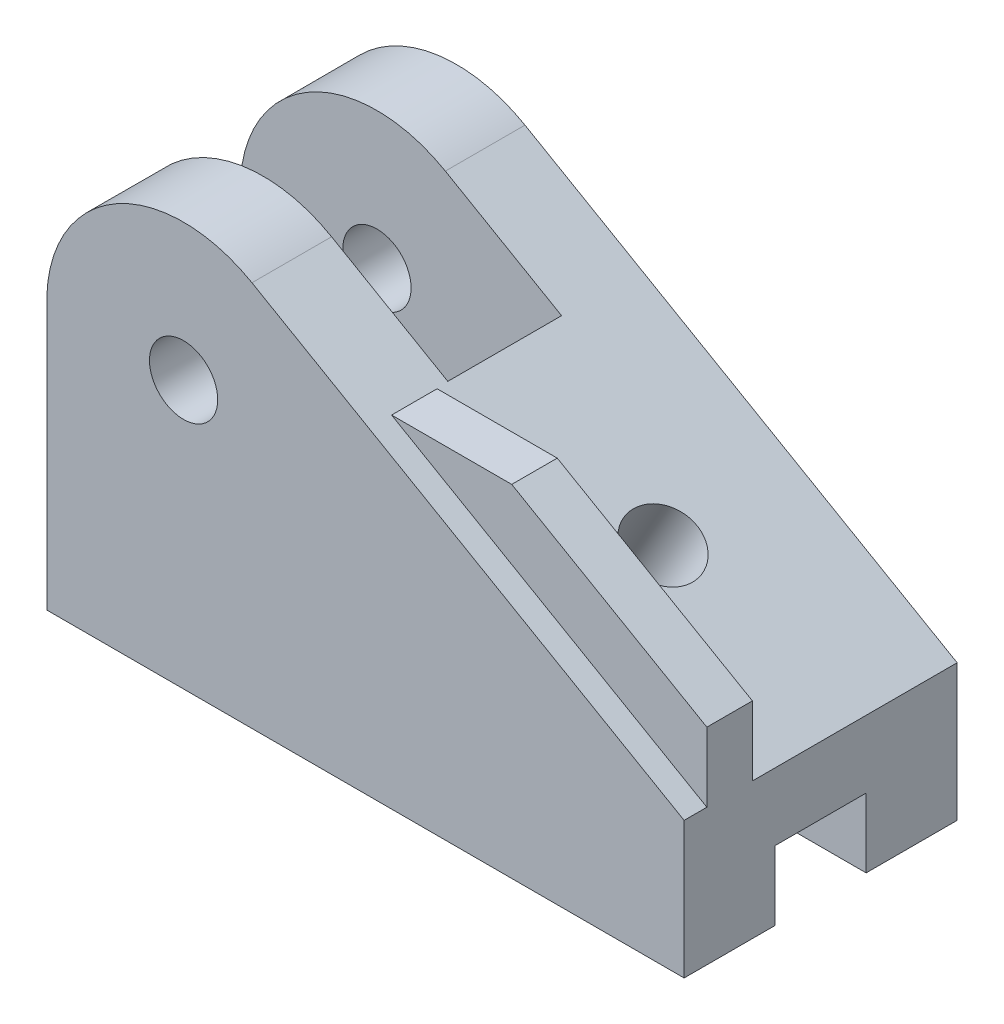
ISO-10303-21;
HEADER;
FILE_DESCRIPTION(('STEP AP214'),'2;1');
FILE_NAME('part.step','',(''),(''),'','','');
FILE_SCHEMA(('AUTOMOTIVE_DESIGN { 1 0 10303 214 1 1 1 1 }'));
ENDSEC;
DATA;
#1=APPLICATION_CONTEXT('core data for automotive mechanical design processes');
#2=APPLICATION_PROTOCOL_DEFINITION('international standard','automotive_design',2000,#1);
#3=PRODUCT_CONTEXT('',#1,'mechanical');
#4=PRODUCT('Part','Part','',(#3));
#5=PRODUCT_RELATED_PRODUCT_CATEGORY('part','',(#4));
#6=PRODUCT_DEFINITION_FORMATION('','',#4);
#7=PRODUCT_DEFINITION_CONTEXT('part definition',#1,'design');
#8=PRODUCT_DEFINITION('design','',#6,#7);
#9=PRODUCT_DEFINITION_SHAPE('','',#8);
#10=(LENGTH_UNIT() NAMED_UNIT(*) SI_UNIT(.MILLI.,.METRE.));
#11=(NAMED_UNIT(*) PLANE_ANGLE_UNIT() SI_UNIT($,.RADIAN.));
#12=(NAMED_UNIT(*) SI_UNIT($,.STERADIAN.) SOLID_ANGLE_UNIT());
#13=UNCERTAINTY_MEASURE_WITH_UNIT(LENGTH_MEASURE(1.E-05),#10,'distance_accuracy_value','');
#14=(GEOMETRIC_REPRESENTATION_CONTEXT(3) GLOBAL_UNCERTAINTY_ASSIGNED_CONTEXT((#13)) GLOBAL_UNIT_ASSIGNED_CONTEXT((#10,
#11,#12)) REPRESENTATION_CONTEXT('',''));
#15=CARTESIAN_POINT('',(0.,0.,0.));
#16=DIRECTION('',(0.,0.,1.));
#17=DIRECTION('',(1.,0.,0.));
#18=AXIS2_PLACEMENT_3D('',#15,#16,#17);
#19=CARTESIAN_POINT('',(30.4738919710462,52.7823291982181,19.05));
#20=DIRECTION('',(-0.499999999999994,-0.866025403784442,0.));
#21=DIRECTION('',(0.866025403784442,-0.499999999999994,0.));
#22=AXIS2_PLACEMENT_3D('',#19,#20,#21);
#23=PLANE('',#22);
#24=CARTESIAN_POINT('',(66.9029547438752,31.7499999999999,0.));
#25=DIRECTION('',(0.499999999999994,0.866025403784442,0.));
#26=DIRECTION('',(-0.866025403784442,0.499999999999995,0.));
#27=AXIS2_PLACEMENT_3D('',#24,#25,#26);
#28=CIRCLE('',#27,4.76249999999998);
#29=CARTESIAN_POINT('',(62.7785087583518,34.1312499999999,0.));
#30=VERTEX_POINT('',#29);
#31=EDGE_CURVE('E322',#30,#30,#28,.T.);
#32=ORIENTED_EDGE('',*,*,#31,.F.);
#33=EDGE_LOOP('',(#32));
#34=FACE_BOUND('',#33,.T.);
#35=DIRECTION('',(0.,0.,-1.));
#36=VECTOR('',#35,1.);
#37=CARTESIAN_POINT('',(28.5935637077948,53.8679372271712,19.05));
#38=LINE('',#37,#36);
#39=CARTESIAN_POINT('',(28.5935637077948,53.8679372271712,-7.9375));
#40=VERTEX_POINT('',#39);
#41=CARTESIAN_POINT('',(28.5935637077948,53.8679372271712,-19.05));
#42=VERTEX_POINT('',#41);
#43=EDGE_CURVE('E300',#40,#42,#38,.T.);
#44=ORIENTED_EDGE('',*,*,#43,.F.);
#45=DIRECTION('',(0.866025403784442,-0.499999999999994,0.));
#46=VECTOR('',#45,1.);
#47=CARTESIAN_POINT('',(30.4738919710462,52.7823291982181,-7.9375));
#48=LINE('',#47,#46);
#49=CARTESIAN_POINT('',(44.8118693429842,44.5042941028951,-7.9375));
#50=VERTEX_POINT('',#49);
#51=EDGE_CURVE('E205',#40,#50,#48,.T.);
#52=ORIENTED_EDGE('',*,*,#51,.T.);
#53=DIRECTION('',(0.,0.,1.));
#54=VECTOR('',#53,1.);
#55=CARTESIAN_POINT('',(44.8118693429842,44.5042941028951,19.05));
#56=LINE('',#55,#54);
#57=CARTESIAN_POINT('',(44.8118693429842,44.5042941028951,7.9375));
#58=VERTEX_POINT('',#57);
#59=EDGE_CURVE('E11',#50,#58,#56,.T.);
#60=ORIENTED_EDGE('',*,*,#59,.T.);
#61=DIRECTION('',(0.866025403784442,-0.499999999999994,0.));
#62=VECTOR('',#61,1.);
#63=CARTESIAN_POINT('',(30.4738919710462,52.7823291982181,7.9375));
#64=LINE('',#63,#62);
#65=CARTESIAN_POINT('',(28.5935637077948,53.8679372271712,7.9375));
#66=VERTEX_POINT('',#65);
#67=EDGE_CURVE('E200',#66,#58,#64,.T.);
#68=ORIENTED_EDGE('',*,*,#67,.F.);
#69=CARTESIAN_POINT('',(28.5935637077948,53.8679372271712,19.05));
#70=VERTEX_POINT('',#69);
#71=EDGE_CURVE('E302',#70,#66,#38,.T.);
#72=ORIENTED_EDGE('',*,*,#71,.F.);
#73=DIRECTION('',(-0.866025403784442,0.499999999999994,0.));
#74=VECTOR('',#73,1.);
#75=CARTESIAN_POINT('',(30.4738919710462,52.7823291982181,19.05));
#76=LINE('',#75,#74);
#77=CARTESIAN_POINT('',(88.9,19.05,19.05));
#78=VERTEX_POINT('',#77);
#79=EDGE_CURVE('E260',#78,#70,#76,.T.);
#80=ORIENTED_EDGE('',*,*,#79,.F.);
#81=DIRECTION('',(0.,0.,-1.));
#82=VECTOR('',#81,1.);
#83=CARTESIAN_POINT('',(88.9,19.05,19.05));
#84=LINE('',#83,#82);
#85=CARTESIAN_POINT('',(88.9,19.05,15.875));
#86=VERTEX_POINT('',#85);
#87=EDGE_CURVE('E287',#78,#86,#84,.T.);
#88=ORIENTED_EDGE('',*,*,#87,.T.);
#89=DIRECTION('',(0.866025403784442,-0.499999999999995,0.));
#90=VECTOR('',#89,1.);
#91=CARTESIAN_POINT('',(88.9,19.05,15.875));
#92=LINE('',#91,#90);
#93=CARTESIAN_POINT('',(44.9059094877499,44.45,15.875));
#94=VERTEX_POINT('',#93);
#95=EDGE_CURVE('E209',#94,#86,#92,.T.);
#96=ORIENTED_EDGE('',*,*,#95,.F.);
#97=DIRECTION('',(0.,0.,-1.));
#98=VECTOR('',#97,1.);
#99=CARTESIAN_POINT('',(44.9059094877499,44.45,15.875));
#100=LINE('',#99,#98);
#101=CARTESIAN_POINT('',(44.9059094877499,44.45,9.525));
#102=VERTEX_POINT('',#101);
#103=EDGE_CURVE('E220',#94,#102,#100,.T.);
#104=ORIENTED_EDGE('',*,*,#103,.T.);
#105=DIRECTION('',(0.866025403784442,-0.499999999999995,0.));
#106=VECTOR('',#105,1.);
#107=CARTESIAN_POINT('',(88.9,19.05,9.525));
#108=LINE('',#107,#106);
#109=CARTESIAN_POINT('',(88.9,19.05,9.525));
#110=VERTEX_POINT('',#109);
#111=EDGE_CURVE('E208',#102,#110,#108,.T.);
#112=ORIENTED_EDGE('',*,*,#111,.T.);
#113=CARTESIAN_POINT('',(88.9,19.05,-19.05));
#114=VERTEX_POINT('',#113);
#115=EDGE_CURVE('E273',#110,#114,#84,.T.);
#116=ORIENTED_EDGE('',*,*,#115,.T.);
#117=DIRECTION('',(-0.866025403784442,0.499999999999994,0.));
#118=VECTOR('',#117,1.);
#119=CARTESIAN_POINT('',(30.4738919710462,52.7823291982181,-19.05));
#120=LINE('',#119,#118);
#121=EDGE_CURVE('E259',#114,#42,#120,.T.);
#122=ORIENTED_EDGE('',*,*,#121,.T.);
#123=EDGE_LOOP('',(#44,#52,#60,#68,#72,#80,#88,#96,#104,#112,#116,#122));
#124=FACE_BOUND('',#123,.T.);
#125=ADVANCED_FACE('F40',(#34,#124),#23,.F.);
#126=CARTESIAN_POINT('',(0.,0.,19.05));
#127=DIRECTION('',(0.,1.,0.));
#128=DIRECTION('',(0.,0.,1.));
#129=AXIS2_PLACEMENT_3D('',#126,#127,#128);
#130=PLANE('',#129);
#131=DIRECTION('',(0.,0.,-1.));
#132=VECTOR('',#131,1.);
#133=CARTESIAN_POINT('',(0.,0.,19.05));
#134=LINE('',#133,#132);
#135=CARTESIAN_POINT('',(0.,0.,19.05));
#136=VERTEX_POINT('',#135);
#137=CARTESIAN_POINT('',(0.,0.,6.35));
#138=VERTEX_POINT('',#137);
#139=EDGE_CURVE('E294',#136,#138,#134,.T.);
#140=ORIENTED_EDGE('',*,*,#139,.T.);
#141=DIRECTION('',(1.,0.,0.));
#142=VECTOR('',#141,1.);
#143=CARTESIAN_POINT('',(-0.0371274155897411,0.,6.35));
#144=LINE('',#143,#142);
#145=CARTESIAN_POINT('',(88.9,0.,6.35));
#146=VERTEX_POINT('',#145);
#147=EDGE_CURVE('E245',#138,#146,#144,.T.);
#148=ORIENTED_EDGE('',*,*,#147,.T.);
#149=DIRECTION('',(0.,0.,-1.));
#150=VECTOR('',#149,1.);
#151=CARTESIAN_POINT('',(88.9,0.,19.05));
#152=LINE('',#151,#150);
#153=CARTESIAN_POINT('',(88.9,0.,19.05));
#154=VERTEX_POINT('',#153);
#155=EDGE_CURVE('E290',#154,#146,#152,.T.);
#156=ORIENTED_EDGE('',*,*,#155,.F.);
#157=DIRECTION('',(1.,0.,0.));
#158=VECTOR('',#157,1.);
#159=CARTESIAN_POINT('',(0.,0.,19.05));
#160=LINE('',#159,#158);
#161=EDGE_CURVE('E269',#136,#154,#160,.T.);
#162=ORIENTED_EDGE('',*,*,#161,.F.);
#163=EDGE_LOOP('',(#140,#148,#156,#162));
#164=FACE_BOUND('',#163,.T.);
#165=ADVANCED_FACE('F362',(#164),#130,.F.);
#166=CARTESIAN_POINT('',(19.05,37.338,19.05));
#167=DIRECTION('',(0.,0.,-1.));
#168=DIRECTION('',(-1.,0.,0.));
#169=AXIS2_PLACEMENT_3D('',#166,#167,#168);
#170=CYLINDRICAL_SURFACE('',#169,19.0871274155897);
#171=DIRECTION('',(0.,0.,-1.));
#172=VECTOR('',#171,1.);
#173=CARTESIAN_POINT('',(0.,38.527929821022,19.05));
#174=LINE('',#173,#172);
#175=CARTESIAN_POINT('',(0.,38.527929821022,7.9375));
#176=VERTEX_POINT('',#175);
#177=CARTESIAN_POINT('',(0.,38.527929821022,-7.9375));
#178=VERTEX_POINT('',#177);
#179=EDGE_CURVE('E47',#176,#178,#174,.T.);
#180=ORIENTED_EDGE('',*,*,#179,.T.);
#181=CARTESIAN_POINT('',(19.05,37.338,-7.9375));
#182=DIRECTION('',(0.,0.,-1.));
#183=DIRECTION('',(-1.,0.,0.));
#184=AXIS2_PLACEMENT_3D('',#181,#182,#183);
#185=CIRCLE('',#184,19.0871274155897);
#186=EDGE_CURVE('E202',#178,#40,#185,.T.);
#187=ORIENTED_EDGE('',*,*,#186,.T.);
#188=ORIENTED_EDGE('',*,*,#43,.T.);
#189=CARTESIAN_POINT('',(19.05,37.338,-19.05));
#190=DIRECTION('',(0.,0.,1.));
#191=DIRECTION('',(1.,0.,0.));
#192=AXIS2_PLACEMENT_3D('',#189,#190,#191);
#193=CIRCLE('',#192,19.0871274155897);
#194=CARTESIAN_POINT('',(0.,36.148070178978,-19.05));
#195=VERTEX_POINT('',#194);
#196=EDGE_CURVE('E276',#42,#195,#193,.T.);
#197=ORIENTED_EDGE('',*,*,#196,.T.);
#198=DIRECTION('',(0.,0.,-1.));
#199=VECTOR('',#198,1.);
#200=CARTESIAN_POINT('',(0.,36.148070178978,19.05));
#201=LINE('',#200,#199);
#202=CARTESIAN_POINT('',(0.,36.148070178978,-7.9375));
#203=VERTEX_POINT('',#202);
#204=EDGE_CURVE('E297',#203,#195,#201,.T.);
#205=ORIENTED_EDGE('',*,*,#204,.F.);
#206=CARTESIAN_POINT('',(0.,36.148070178978,7.9375));
#207=VERTEX_POINT('',#206);
#208=EDGE_CURVE('E301',#207,#203,#201,.T.);
#209=ORIENTED_EDGE('',*,*,#208,.F.);
#210=CARTESIAN_POINT('',(0.,36.148070178978,19.05));
#211=VERTEX_POINT('',#210);
#212=EDGE_CURVE('E298',#211,#207,#201,.T.);
#213=ORIENTED_EDGE('',*,*,#212,.F.);
#214=CARTESIAN_POINT('',(19.05,37.338,19.05));
#215=DIRECTION('',(0.,0.,1.));
#216=DIRECTION('',(1.,0.,0.));
#217=AXIS2_PLACEMENT_3D('',#214,#215,#216);
#218=CIRCLE('',#217,19.0871274155897);
#219=EDGE_CURVE('E263',#70,#211,#218,.T.);
#220=ORIENTED_EDGE('',*,*,#219,.F.);
#221=ORIENTED_EDGE('',*,*,#71,.T.);
#222=CARTESIAN_POINT('',(19.05,37.338,7.9375));
#223=DIRECTION('',(0.,0.,-1.));
#224=DIRECTION('',(-1.,0.,0.));
#225=AXIS2_PLACEMENT_3D('',#222,#223,#224);
#226=CIRCLE('',#225,19.0871274155897);
#227=EDGE_CURVE('E194',#176,#66,#226,.T.);
#228=ORIENTED_EDGE('',*,*,#227,.F.);
#229=EDGE_LOOP('',(#180,#187,#188,#197,#205,#209,#213,#220,#221,#228));
#230=FACE_BOUND('',#229,.T.);
#231=ADVANCED_FACE('F308',(#230),#170,.T.);
#232=CARTESIAN_POINT('',(0.,0.,19.05));
#233=DIRECTION('',(-1.,0.,0.));
#234=DIRECTION('',(0.,0.,1.));
#235=AXIS2_PLACEMENT_3D('',#232,#233,#234);
#236=PLANE('',#235);
#237=DIRECTION('',(0.,-1.,0.));
#238=VECTOR('',#237,1.);
#239=CARTESIAN_POINT('',(0.,0.,-7.9375));
#240=LINE('',#239,#238);
#241=CARTESIAN_POINT('',(0.,25.4,-7.9375));
#242=VERTEX_POINT('',#241);
#243=EDGE_CURVE('E171',#203,#242,#240,.T.);
#244=ORIENTED_EDGE('',*,*,#243,.F.);
#245=ORIENTED_EDGE('',*,*,#204,.T.);
#246=DIRECTION('',(0.,1.,0.));
#247=VECTOR('',#246,1.);
#248=CARTESIAN_POINT('',(0.,0.,-19.05));
#249=LINE('',#248,#247);
#250=CARTESIAN_POINT('',(0.,0.,-19.05));
#251=VERTEX_POINT('',#250);
#252=EDGE_CURVE('E279',#251,#195,#249,.T.);
#253=ORIENTED_EDGE('',*,*,#252,.F.);
#254=CARTESIAN_POINT('',(0.,0.,-6.35));
#255=VERTEX_POINT('',#254);
#256=EDGE_CURVE('E293',#255,#251,#134,.T.);
#257=ORIENTED_EDGE('',*,*,#256,.F.);
#258=DIRECTION('',(0.,-1.,0.));
#259=VECTOR('',#258,1.);
#260=CARTESIAN_POINT('',(0.,0.,-6.35));
#261=LINE('',#260,#259);
#262=CARTESIAN_POINT('',(0.,9.652,-6.35));
#263=VERTEX_POINT('',#262);
#264=EDGE_CURVE('E248',#263,#255,#261,.T.);
#265=ORIENTED_EDGE('',*,*,#264,.F.);
#266=DIRECTION('',(0.,0.,-1.));
#267=VECTOR('',#266,1.);
#268=CARTESIAN_POINT('',(0.,9.652,19.05));
#269=LINE('',#268,#267);
#270=CARTESIAN_POINT('',(0.,9.652,6.35));
#271=VERTEX_POINT('',#270);
#272=EDGE_CURVE('E255',#271,#263,#269,.T.);
#273=ORIENTED_EDGE('',*,*,#272,.F.);
#274=DIRECTION('',(0.,1.,0.));
#275=VECTOR('',#274,1.);
#276=CARTESIAN_POINT('',(0.,0.,6.35));
#277=LINE('',#276,#275);
#278=EDGE_CURVE('E257',#138,#271,#277,.T.);
#279=ORIENTED_EDGE('',*,*,#278,.F.);
#280=ORIENTED_EDGE('',*,*,#139,.F.);
#281=DIRECTION('',(0.,1.,0.));
#282=VECTOR('',#281,1.);
#283=CARTESIAN_POINT('',(0.,0.,19.05));
#284=LINE('',#283,#282);
#285=EDGE_CURVE('E266',#136,#211,#284,.T.);
#286=ORIENTED_EDGE('',*,*,#285,.T.);
#287=ORIENTED_EDGE('',*,*,#212,.T.);
#288=DIRECTION('',(0.,-1.,0.));
#289=VECTOR('',#288,1.);
#290=CARTESIAN_POINT('',(0.,0.,7.9375));
#291=LINE('',#290,#289);
#292=CARTESIAN_POINT('',(0.,25.4,7.9375));
#293=VERTEX_POINT('',#292);
#294=EDGE_CURVE('E181',#207,#293,#291,.T.);
#295=ORIENTED_EDGE('',*,*,#294,.T.);
#296=DIRECTION('',(0.,0.,1.));
#297=VECTOR('',#296,1.);
#298=CARTESIAN_POINT('',(0.,25.4,-7.9375));
#299=LINE('',#298,#297);
#300=EDGE_CURVE('E185',#242,#293,#299,.T.);
#301=ORIENTED_EDGE('',*,*,#300,.F.);
#302=EDGE_LOOP('',(#244,#245,#253,#257,#265,#273,#279,#280,#286,#287,#295,#301));
#303=FACE_BOUND('',#302,.T.);
#304=ADVANCED_FACE('F191',(#303),#236,.T.);
#305=CARTESIAN_POINT('',(88.9,0.,-6.34999999999999));
#306=VERTEX_POINT('',#305);
#307=CARTESIAN_POINT('',(88.9,0.,-19.05));
#308=VERTEX_POINT('',#307);
#309=EDGE_CURVE('E289',#306,#308,#152,.T.);
#310=ORIENTED_EDGE('',*,*,#309,.F.);
#311=DIRECTION('',(1.,0.,0.));
#312=VECTOR('',#311,1.);
#313=CARTESIAN_POINT('',(-0.0371274155897411,0.,-6.35));
#314=LINE('',#313,#312);
#315=EDGE_CURVE('E244',#255,#306,#314,.T.);
#316=ORIENTED_EDGE('',*,*,#315,.F.);
#317=ORIENTED_EDGE('',*,*,#256,.T.);
#318=DIRECTION('',(1.,0.,0.));
#319=VECTOR('',#318,1.);
#320=CARTESIAN_POINT('',(0.,0.,-19.05));
#321=LINE('',#320,#319);
#322=EDGE_CURVE('E282',#251,#308,#321,.T.);
#323=ORIENTED_EDGE('',*,*,#322,.T.);
#324=EDGE_LOOP('',(#310,#316,#317,#323));
#325=FACE_BOUND('',#324,.T.);
#326=ADVANCED_FACE('F411',(#325),#130,.F.);
#327=CARTESIAN_POINT('',(88.9,0.,19.05));
#328=DIRECTION('',(-1.,0.,0.));
#329=DIRECTION('',(0.,0.,1.));
#330=AXIS2_PLACEMENT_3D('',#327,#328,#329);
#331=PLANE('',#330);
#332=ORIENTED_EDGE('',*,*,#155,.T.);
#333=DIRECTION('',(0.,-1.,0.));
#334=VECTOR('',#333,1.);
#335=CARTESIAN_POINT('',(88.9,0.,6.35));
#336=LINE('',#335,#334);
#337=CARTESIAN_POINT('',(88.9,9.652,6.35));
#338=VERTEX_POINT('',#337);
#339=EDGE_CURVE('E242',#338,#146,#336,.T.);
#340=ORIENTED_EDGE('',*,*,#339,.F.);
#341=DIRECTION('',(0.,0.,1.));
#342=VECTOR('',#341,1.);
#343=CARTESIAN_POINT('',(88.9,9.652,-6.35));
#344=LINE('',#343,#342);
#345=CARTESIAN_POINT('',(88.9,9.652,-6.35));
#346=VERTEX_POINT('',#345);
#347=EDGE_CURVE('E239',#346,#338,#344,.T.);
#348=ORIENTED_EDGE('',*,*,#347,.F.);
#349=DIRECTION('',(0.,1.,0.));
#350=VECTOR('',#349,1.);
#351=CARTESIAN_POINT('',(88.9,0.,-6.35));
#352=LINE('',#351,#350);
#353=EDGE_CURVE('E236',#306,#346,#352,.T.);
#354=ORIENTED_EDGE('',*,*,#353,.F.);
#355=ORIENTED_EDGE('',*,*,#309,.T.);
#356=DIRECTION('',(0.,1.,0.));
#357=VECTOR('',#356,1.);
#358=CARTESIAN_POINT('',(88.9,0.,-19.05));
#359=LINE('',#358,#357);
#360=EDGE_CURVE('E264',#308,#114,#359,.T.);
#361=ORIENTED_EDGE('',*,*,#360,.T.);
#362=ORIENTED_EDGE('',*,*,#115,.F.);
#363=DIRECTION('',(0.,1.,0.));
#364=VECTOR('',#363,1.);
#365=CARTESIAN_POINT('',(88.9,19.05,9.525));
#366=LINE('',#365,#364);
#367=CARTESIAN_POINT('',(88.9,28.7286999126949,9.525));
#368=VERTEX_POINT('',#367);
#369=EDGE_CURVE('E223',#110,#368,#366,.T.);
#370=ORIENTED_EDGE('',*,*,#369,.T.);
#371=DIRECTION('',(0.,0.,-1.));
#372=VECTOR('',#371,1.);
#373=CARTESIAN_POINT('',(88.9,28.7286999126949,15.875));
#374=LINE('',#373,#372);
#375=CARTESIAN_POINT('',(88.9,28.7286999126949,15.875));
#376=VERTEX_POINT('',#375);
#377=EDGE_CURVE('E233',#376,#368,#374,.T.);
#378=ORIENTED_EDGE('',*,*,#377,.F.);
#379=DIRECTION('',(0.,1.,0.));
#380=VECTOR('',#379,1.);
#381=CARTESIAN_POINT('',(88.9,19.05,15.875));
#382=LINE('',#381,#380);
#383=EDGE_CURVE('E212',#86,#376,#382,.T.);
#384=ORIENTED_EDGE('',*,*,#383,.F.);
#385=ORIENTED_EDGE('',*,*,#87,.F.);
#386=DIRECTION('',(0.,1.,0.));
#387=VECTOR('',#386,1.);
#388=CARTESIAN_POINT('',(88.9,0.,19.05));
#389=LINE('',#388,#387);
#390=EDGE_CURVE('E271',#154,#78,#389,.T.);
#391=ORIENTED_EDGE('',*,*,#390,.F.);
#392=EDGE_LOOP('',(#332,#340,#348,#354,#355,#361,#362,#370,#378,#384,#385,#391));
#393=FACE_BOUND('',#392,.T.);
#394=ADVANCED_FACE('F348',(#393),#331,.F.);
#395=CARTESIAN_POINT('',(0.,0.,19.05));
#396=DIRECTION('',(0.,0.,1.));
#397=DIRECTION('',(1.,0.,0.));
#398=AXIS2_PLACEMENT_3D('',#395,#396,#397);
#399=PLANE('',#398);
#400=CARTESIAN_POINT('',(19.05,37.338,19.05));
#401=DIRECTION('',(0.,0.,1.));
#402=DIRECTION('',(1.,0.,0.));
#403=AXIS2_PLACEMENT_3D('',#400,#401,#402);
#404=CIRCLE('',#403,4.76249999999999);
#405=CARTESIAN_POINT('',(23.8125,37.338,19.05));
#406=VERTEX_POINT('',#405);
#407=EDGE_CURVE('E338',#406,#406,#404,.T.);
#408=ORIENTED_EDGE('',*,*,#407,.F.);
#409=EDGE_LOOP('',(#408));
#410=FACE_BOUND('',#409,.T.);
#411=ORIENTED_EDGE('',*,*,#79,.T.);
#412=ORIENTED_EDGE('',*,*,#219,.T.);
#413=ORIENTED_EDGE('',*,*,#285,.F.);
#414=ORIENTED_EDGE('',*,*,#161,.T.);
#415=ORIENTED_EDGE('',*,*,#390,.T.);
#416=EDGE_LOOP('',(#411,#412,#413,#414,#415));
#417=FACE_BOUND('',#416,.T.);
#418=ADVANCED_FACE('F344',(#410,#417),#399,.T.);
#419=CARTESIAN_POINT('',(0.,0.,-19.05));
#420=DIRECTION('',(0.,0.,1.));
#421=DIRECTION('',(1.,0.,0.));
#422=AXIS2_PLACEMENT_3D('',#419,#420,#421);
#423=PLANE('',#422);
#424=CARTESIAN_POINT('',(19.05,37.338,-19.05));
#425=DIRECTION('',(0.,0.,1.));
#426=DIRECTION('',(1.,0.,0.));
#427=AXIS2_PLACEMENT_3D('',#424,#425,#426);
#428=CIRCLE('',#427,4.76249999999998);
#429=CARTESIAN_POINT('',(23.8125,37.338,-19.05));
#430=VERTEX_POINT('',#429);
#431=EDGE_CURVE('E335',#430,#430,#428,.T.);
#432=ORIENTED_EDGE('',*,*,#431,.T.);
#433=EDGE_LOOP('',(#432));
#434=FACE_BOUND('',#433,.T.);
#435=ORIENTED_EDGE('',*,*,#121,.F.);
#436=ORIENTED_EDGE('',*,*,#360,.F.);
#437=ORIENTED_EDGE('',*,*,#322,.F.);
#438=ORIENTED_EDGE('',*,*,#252,.T.);
#439=ORIENTED_EDGE('',*,*,#196,.F.);
#440=EDGE_LOOP('',(#435,#436,#437,#438,#439));
#441=FACE_BOUND('',#440,.T.);
#442=ADVANCED_FACE('F347',(#434,#441),#423,.F.);
#443=CARTESIAN_POINT('',(-0.0371274155897411,0.,6.35));
#444=DIRECTION('',(0.,0.,1.));
#445=DIRECTION('',(1.,0.,0.));
#446=AXIS2_PLACEMENT_3D('',#443,#444,#445);
#447=PLANE('',#446);
#448=ORIENTED_EDGE('',*,*,#278,.T.);
#449=DIRECTION('',(1.,0.,0.));
#450=VECTOR('',#449,1.);
#451=CARTESIAN_POINT('',(-0.0371274155897411,9.652,6.35));
#452=LINE('',#451,#450);
#453=EDGE_CURVE('E249',#271,#338,#452,.T.);
#454=ORIENTED_EDGE('',*,*,#453,.T.);
#455=ORIENTED_EDGE('',*,*,#339,.T.);
#456=ORIENTED_EDGE('',*,*,#147,.F.);
#457=EDGE_LOOP('',(#448,#454,#455,#456));
#458=FACE_BOUND('',#457,.T.);
#459=ADVANCED_FACE('F435',(#458),#447,.F.);
#460=CARTESIAN_POINT('',(-0.0371274155897411,9.652,-6.35));
#461=DIRECTION('',(0.,1.,0.));
#462=DIRECTION('',(0.,0.,1.));
#463=AXIS2_PLACEMENT_3D('',#460,#461,#462);
#464=PLANE('',#463);
#465=CARTESIAN_POINT('',(54.1446684953231,9.652,0.));
#466=DIRECTION('',(0.,1.,0.));
#467=DIRECTION('',(1.,0.,0.));
#468=AXIS2_PLACEMENT_3D('',#465,#466,#467);
#469=ELLIPSE('',#468,5.49926131403114,4.76249999999998);
#470=CARTESIAN_POINT('',(59.6439298093542,9.652,0.));
#471=VERTEX_POINT('',#470);
#472=EDGE_CURVE('E317',#471,#471,#469,.T.);
#473=ORIENTED_EDGE('',*,*,#472,.T.);
#474=EDGE_LOOP('',(#473));
#475=FACE_BOUND('',#474,.T.);
#476=ORIENTED_EDGE('',*,*,#272,.T.);
#477=DIRECTION('',(1.,0.,0.));
#478=VECTOR('',#477,1.);
#479=CARTESIAN_POINT('',(-0.0371274155897411,9.652,-6.35));
#480=LINE('',#479,#478);
#481=EDGE_CURVE('E251',#263,#346,#480,.T.);
#482=ORIENTED_EDGE('',*,*,#481,.T.);
#483=ORIENTED_EDGE('',*,*,#347,.T.);
#484=ORIENTED_EDGE('',*,*,#453,.F.);
#485=EDGE_LOOP('',(#476,#482,#483,#484));
#486=FACE_BOUND('',#485,.T.);
#487=ADVANCED_FACE('F432',(#475,#486),#464,.F.);
#488=CARTESIAN_POINT('',(-0.0371274155897411,0.,-6.35));
#489=DIRECTION('',(0.,0.,-1.));
#490=DIRECTION('',(-1.,0.,0.));
#491=AXIS2_PLACEMENT_3D('',#488,#489,#490);
#492=PLANE('',#491);
#493=ORIENTED_EDGE('',*,*,#264,.T.);
#494=ORIENTED_EDGE('',*,*,#315,.T.);
#495=ORIENTED_EDGE('',*,*,#353,.T.);
#496=ORIENTED_EDGE('',*,*,#481,.F.);
#497=EDGE_LOOP('',(#493,#494,#495,#496));
#498=FACE_BOUND('',#497,.T.);
#499=ADVANCED_FACE('F429',(#498),#492,.F.);
#500=CARTESIAN_POINT('',(88.9,28.7286999126949,15.875));
#501=DIRECTION('',(-0.5,-0.866025403784438,0.));
#502=DIRECTION('',(0.866025403784439,-0.5,0.));
#503=AXIS2_PLACEMENT_3D('',#500,#501,#502);
#504=PLANE('',#503);
#505=DIRECTION('',(-0.866025403784439,0.5,0.));
#506=VECTOR('',#505,1.);
#507=CARTESIAN_POINT('',(88.9,28.7286999126949,9.525));
#508=LINE('',#507,#506);
#509=CARTESIAN_POINT('',(61.6699094877505,44.45,9.525));
#510=VERTEX_POINT('',#509);
#511=EDGE_CURVE('E225',#368,#510,#508,.T.);
#512=ORIENTED_EDGE('',*,*,#511,.T.);
#513=DIRECTION('',(0.,0.,-1.));
#514=VECTOR('',#513,1.);
#515=CARTESIAN_POINT('',(61.6699094877505,44.45,15.875));
#516=LINE('',#515,#514);
#517=CARTESIAN_POINT('',(61.6699094877505,44.45,15.875));
#518=VERTEX_POINT('',#517);
#519=EDGE_CURVE('E230',#518,#510,#516,.T.);
#520=ORIENTED_EDGE('',*,*,#519,.F.);
#521=DIRECTION('',(-0.866025403784439,0.5,0.));
#522=VECTOR('',#521,1.);
#523=CARTESIAN_POINT('',(88.9,28.7286999126949,15.875));
#524=LINE('',#523,#522);
#525=EDGE_CURVE('E215',#376,#518,#524,.T.);
#526=ORIENTED_EDGE('',*,*,#525,.F.);
#527=ORIENTED_EDGE('',*,*,#377,.T.);
#528=EDGE_LOOP('',(#512,#520,#526,#527));
#529=FACE_BOUND('',#528,.T.);
#530=ADVANCED_FACE('F446',(#529),#504,.F.);
#531=CARTESIAN_POINT('',(61.6699094877505,44.45,15.875));
#532=DIRECTION('',(0.,-1.,0.));
#533=DIRECTION('',(0.,0.,-1.));
#534=AXIS2_PLACEMENT_3D('',#531,#532,#533);
#535=PLANE('',#534);
#536=DIRECTION('',(-1.,0.,0.));
#537=VECTOR('',#536,1.);
#538=CARTESIAN_POINT('',(61.6699094877505,44.45,9.525));
#539=LINE('',#538,#537);
#540=EDGE_CURVE('E213',#510,#102,#539,.T.);
#541=ORIENTED_EDGE('',*,*,#540,.T.);
#542=ORIENTED_EDGE('',*,*,#103,.F.);
#543=DIRECTION('',(-1.,0.,0.));
#544=VECTOR('',#543,1.);
#545=CARTESIAN_POINT('',(61.6699094877505,44.45,15.875));
#546=LINE('',#545,#544);
#547=EDGE_CURVE('E217',#518,#94,#546,.T.);
#548=ORIENTED_EDGE('',*,*,#547,.F.);
#549=ORIENTED_EDGE('',*,*,#519,.T.);
#550=EDGE_LOOP('',(#541,#542,#548,#549));
#551=FACE_BOUND('',#550,.T.);
#552=ADVANCED_FACE('F374',(#551),#535,.F.);
#553=CARTESIAN_POINT('',(0.,0.,15.875));
#554=DIRECTION('',(0.,0.,-1.));
#555=DIRECTION('',(-1.,0.,0.));
#556=AXIS2_PLACEMENT_3D('',#553,#554,#555);
#557=PLANE('',#556);
#558=ORIENTED_EDGE('',*,*,#95,.T.);
#559=ORIENTED_EDGE('',*,*,#383,.T.);
#560=ORIENTED_EDGE('',*,*,#525,.T.);
#561=ORIENTED_EDGE('',*,*,#547,.T.);
#562=EDGE_LOOP('',(#558,#559,#560,#561));
#563=FACE_BOUND('',#562,.T.);
#564=ADVANCED_FACE('F370',(#563),#557,.F.);
#565=CARTESIAN_POINT('',(0.,0.,9.525));
#566=DIRECTION('',(0.,0.,-1.));
#567=DIRECTION('',(-1.,0.,0.));
#568=AXIS2_PLACEMENT_3D('',#565,#566,#567);
#569=PLANE('',#568);
#570=ORIENTED_EDGE('',*,*,#111,.F.);
#571=ORIENTED_EDGE('',*,*,#540,.F.);
#572=ORIENTED_EDGE('',*,*,#511,.F.);
#573=ORIENTED_EDGE('',*,*,#369,.F.);
#574=EDGE_LOOP('',(#570,#571,#572,#573));
#575=FACE_BOUND('',#574,.T.);
#576=ADVANCED_FACE('F380',(#575),#569,.T.);
#577=CARTESIAN_POINT('',(33.782,25.4,-7.9375));
#578=DIRECTION('',(0.86602540378444,-0.499999999999998,0.));
#579=DIRECTION('',(0.499999999999998,0.86602540378444,0.));
#580=AXIS2_PLACEMENT_3D('',#577,#578,#579);
#581=PLANE('',#580);
#582=DIRECTION('',(0.499999999999998,0.86602540378444,0.));
#583=VECTOR('',#582,1.);
#584=CARTESIAN_POINT('',(33.782,25.4,-7.9375));
#585=LINE('',#584,#583);
#586=CARTESIAN_POINT('',(33.782,25.4,-7.9375));
#587=VERTEX_POINT('',#586);
#588=EDGE_CURVE('E189',#587,#50,#585,.T.);
#589=ORIENTED_EDGE('',*,*,#588,.F.);
#590=DIRECTION('',(0.,0.,1.));
#591=VECTOR('',#590,1.);
#592=CARTESIAN_POINT('',(33.782,25.4,-7.9375));
#593=LINE('',#592,#591);
#594=CARTESIAN_POINT('',(33.782,25.4,7.9375));
#595=VERTEX_POINT('',#594);
#596=EDGE_CURVE('E187',#587,#595,#593,.T.);
#597=ORIENTED_EDGE('',*,*,#596,.T.);
#598=DIRECTION('',(0.499999999999998,0.86602540378444,0.));
#599=VECTOR('',#598,1.);
#600=CARTESIAN_POINT('',(33.782,25.4,7.9375));
#601=LINE('',#600,#599);
#602=EDGE_CURVE('E313',#595,#58,#601,.T.);
#603=ORIENTED_EDGE('',*,*,#602,.T.);
#604=ORIENTED_EDGE('',*,*,#59,.F.);
#605=EDGE_LOOP('',(#589,#597,#603,#604));
#606=FACE_BOUND('',#605,.T.);
#607=ADVANCED_FACE('F390',(#606),#581,.F.);
#608=CARTESIAN_POINT('',(0.,25.4,-7.9375));
#609=DIRECTION('',(-1.,0.,0.));
#610=DIRECTION('',(0.,0.,1.));
#611=AXIS2_PLACEMENT_3D('',#608,#609,#610);
#612=PLANE('',#611);
#613=DIRECTION('',(0.,-1.,0.));
#614=VECTOR('',#613,1.);
#615=CARTESIAN_POINT('',(0.,25.4,7.9375));
#616=LINE('',#615,#614);
#617=EDGE_CURVE('E54',#176,#207,#616,.T.);
#618=ORIENTED_EDGE('',*,*,#617,.T.);
#619=ORIENTED_EDGE('',*,*,#208,.T.);
#620=DIRECTION('',(0.,-1.,0.));
#621=VECTOR('',#620,1.);
#622=CARTESIAN_POINT('',(0.,25.4,-7.9375));
#623=LINE('',#622,#621);
#624=EDGE_CURVE('E177',#178,#203,#623,.T.);
#625=ORIENTED_EDGE('',*,*,#624,.F.);
#626=ORIENTED_EDGE('',*,*,#179,.F.);
#627=EDGE_LOOP('',(#618,#619,#625,#626));
#628=FACE_BOUND('',#627,.T.);
#629=ADVANCED_FACE('F311',(#628),#612,.F.);
#630=CARTESIAN_POINT('',(0.,0.,-7.9375));
#631=DIRECTION('',(0.,0.,-1.));
#632=DIRECTION('',(-1.,0.,0.));
#633=AXIS2_PLACEMENT_3D('',#630,#631,#632);
#634=PLANE('',#633);
#635=CARTESIAN_POINT('',(19.05,37.338,-7.9375));
#636=DIRECTION('',(0.,0.,-1.));
#637=DIRECTION('',(-1.,0.,0.));
#638=AXIS2_PLACEMENT_3D('',#635,#636,#637);
#639=CIRCLE('',#638,4.76249999999998);
#640=CARTESIAN_POINT('',(14.2875,37.338,-7.9375));
#641=VERTEX_POINT('',#640);
#642=EDGE_CURVE('E330',#641,#641,#639,.T.);
#643=ORIENTED_EDGE('',*,*,#642,.T.);
#644=EDGE_LOOP('',(#643));
#645=FACE_BOUND('',#644,.T.);
#646=ORIENTED_EDGE('',*,*,#186,.F.);
#647=ORIENTED_EDGE('',*,*,#624,.T.);
#648=ORIENTED_EDGE('',*,*,#243,.T.);
#649=DIRECTION('',(1.,0.,0.));
#650=VECTOR('',#649,1.);
#651=CARTESIAN_POINT('',(0.,25.4,-7.9375));
#652=LINE('',#651,#650);
#653=EDGE_CURVE('E175',#242,#587,#652,.T.);
#654=ORIENTED_EDGE('',*,*,#653,.T.);
#655=ORIENTED_EDGE('',*,*,#588,.T.);
#656=ORIENTED_EDGE('',*,*,#51,.F.);
#657=EDGE_LOOP('',(#646,#647,#648,#654,#655,#656));
#658=FACE_BOUND('',#657,.T.);
#659=ADVANCED_FACE('F173',(#645,#658),#634,.F.);
#660=CARTESIAN_POINT('',(0.,0.,7.9375));
#661=DIRECTION('',(0.,0.,-1.));
#662=DIRECTION('',(-1.,0.,0.));
#663=AXIS2_PLACEMENT_3D('',#660,#661,#662);
#664=PLANE('',#663);
#665=CARTESIAN_POINT('',(19.05,37.338,7.9375));
#666=DIRECTION('',(0.,0.,-1.));
#667=DIRECTION('',(-1.,0.,0.));
#668=AXIS2_PLACEMENT_3D('',#665,#666,#667);
#669=CIRCLE('',#668,4.76249999999998);
#670=CARTESIAN_POINT('',(14.2875,37.338,7.9375));
#671=VERTEX_POINT('',#670);
#672=EDGE_CURVE('E326',#671,#671,#669,.T.);
#673=ORIENTED_EDGE('',*,*,#672,.F.);
#674=EDGE_LOOP('',(#673));
#675=FACE_BOUND('',#674,.T.);
#676=ORIENTED_EDGE('',*,*,#67,.T.);
#677=ORIENTED_EDGE('',*,*,#602,.F.);
#678=DIRECTION('',(1.,0.,0.));
#679=VECTOR('',#678,1.);
#680=CARTESIAN_POINT('',(0.,25.4,7.9375));
#681=LINE('',#680,#679);
#682=EDGE_CURVE('E60',#293,#595,#681,.T.);
#683=ORIENTED_EDGE('',*,*,#682,.F.);
#684=ORIENTED_EDGE('',*,*,#294,.F.);
#685=ORIENTED_EDGE('',*,*,#617,.F.);
#686=ORIENTED_EDGE('',*,*,#227,.T.);
#687=EDGE_LOOP('',(#676,#677,#683,#684,#685,#686));
#688=FACE_BOUND('',#687,.T.);
#689=ADVANCED_FACE('F391',(#675,#688),#664,.T.);
#690=CARTESIAN_POINT('',(0.,25.4,-7.9375));
#691=DIRECTION('',(0.,-1.,0.));
#692=DIRECTION('',(0.,0.,-1.));
#693=AXIS2_PLACEMENT_3D('',#690,#691,#692);
#694=PLANE('',#693);
#695=ORIENTED_EDGE('',*,*,#682,.T.);
#696=ORIENTED_EDGE('',*,*,#596,.F.);
#697=ORIENTED_EDGE('',*,*,#653,.F.);
#698=ORIENTED_EDGE('',*,*,#300,.T.);
#699=EDGE_LOOP('',(#695,#696,#697,#698));
#700=FACE_BOUND('',#699,.T.);
#701=ADVANCED_FACE('F184',(#700),#694,.F.);
#702=CARTESIAN_POINT('',(66.9029547438752,31.7499999999999,0.));
#703=DIRECTION('',(0.499999999999994,0.866025403784442,0.));
#704=DIRECTION('',(-0.866025403784442,0.499999999999995,0.));
#705=AXIS2_PLACEMENT_3D('',#702,#703,#704);
#706=CYLINDRICAL_SURFACE('',#705,4.76249999999998);
#707=ORIENTED_EDGE('',*,*,#31,.T.);
#708=EDGE_LOOP('',(#707));
#709=FACE_BOUND('',#708,.T.);
#710=ORIENTED_EDGE('',*,*,#472,.F.);
#711=EDGE_LOOP('',(#710));
#712=FACE_BOUND('',#711,.T.);
#713=ADVANCED_FACE('F399',(#709,#712),#706,.F.);
#714=CARTESIAN_POINT('',(19.05,37.338,19.05));
#715=DIRECTION('',(0.,0.,1.));
#716=DIRECTION('',(1.,0.,0.));
#717=AXIS2_PLACEMENT_3D('',#714,#715,#716);
#718=CYLINDRICAL_SURFACE('',#717,4.76249999999998);
#719=ORIENTED_EDGE('',*,*,#672,.T.);
#720=EDGE_LOOP('',(#719));
#721=FACE_BOUND('',#720,.T.);
#722=ORIENTED_EDGE('',*,*,#407,.T.);
#723=EDGE_LOOP('',(#722));
#724=FACE_BOUND('',#723,.T.);
#725=ADVANCED_FACE('F342',(#721,#724),#718,.F.);
#726=ORIENTED_EDGE('',*,*,#431,.F.);
#727=EDGE_LOOP('',(#726));
#728=FACE_BOUND('',#727,.T.);
#729=ORIENTED_EDGE('',*,*,#642,.F.);
#730=EDGE_LOOP('',(#729));
#731=FACE_BOUND('',#730,.T.);
#732=ADVANCED_FACE('F498',(#728,#731),#718,.F.);
#733=CLOSED_SHELL('',(#125,#165,#231,#304,#326,#394,#418,#442,#459,#487,#499,#530,#552,#564,
#576,#607,#629,#659,#689,#701,#713,#725,#732));
#734=MANIFOLD_SOLID_BREP('B2',#733);
#735=ADVANCED_BREP_SHAPE_REPRESENTATION('',(#18,#734),#14);
#736=SHAPE_DEFINITION_REPRESENTATION(#9,#735);
ENDSEC;
END-ISO-10303-21;
